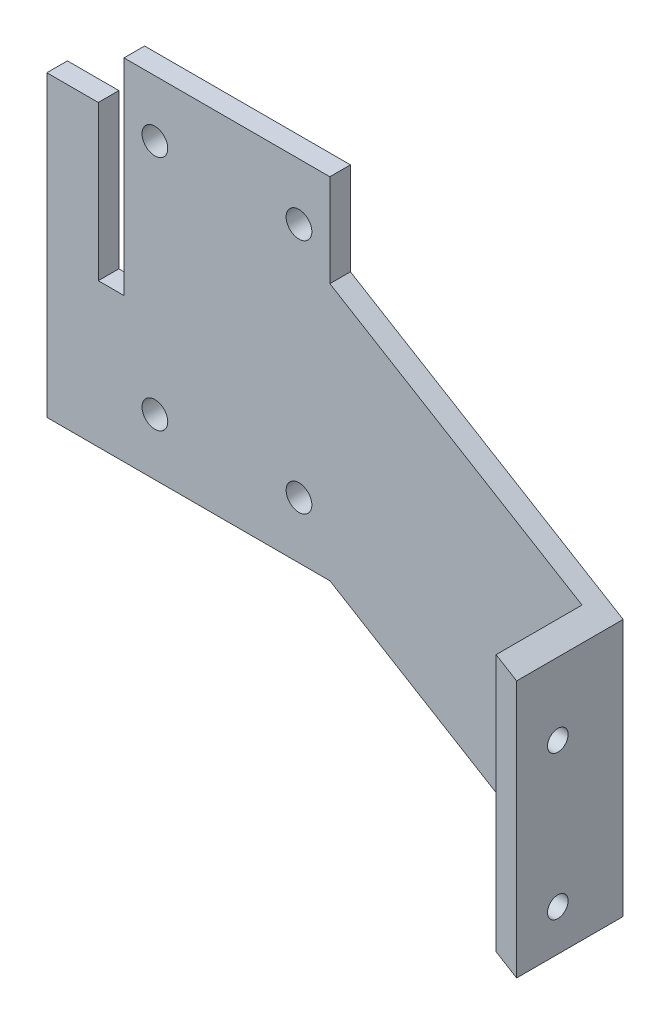
ISO-10303-21;
HEADER;
FILE_DESCRIPTION(('STEP AP214'),'2;1');
FILE_NAME('part.step','',(''),(''),'','','');
FILE_SCHEMA(('AUTOMOTIVE_DESIGN { 1 0 10303 214 1 1 1 1 }'));
ENDSEC;
DATA;
#1=APPLICATION_CONTEXT('core data for automotive mechanical design processes');
#2=APPLICATION_PROTOCOL_DEFINITION('international standard','automotive_design',2000,#1);
#3=PRODUCT_CONTEXT('',#1,'mechanical');
#4=PRODUCT('Part','Part','',(#3));
#5=PRODUCT_RELATED_PRODUCT_CATEGORY('part','',(#4));
#6=PRODUCT_DEFINITION_FORMATION('','',#4);
#7=PRODUCT_DEFINITION_CONTEXT('part definition',#1,'design');
#8=PRODUCT_DEFINITION('design','',#6,#7);
#9=PRODUCT_DEFINITION_SHAPE('','',#8);
#10=(LENGTH_UNIT() NAMED_UNIT(*) SI_UNIT(.MILLI.,.METRE.));
#11=(NAMED_UNIT(*) PLANE_ANGLE_UNIT() SI_UNIT($,.RADIAN.));
#12=(NAMED_UNIT(*) SI_UNIT($,.STERADIAN.) SOLID_ANGLE_UNIT());
#13=UNCERTAINTY_MEASURE_WITH_UNIT(LENGTH_MEASURE(1.E-05),#10,'distance_accuracy_value','');
#14=(GEOMETRIC_REPRESENTATION_CONTEXT(3) GLOBAL_UNCERTAINTY_ASSIGNED_CONTEXT((#13)) GLOBAL_UNIT_ASSIGNED_CONTEXT((#10,
#11,#12)) REPRESENTATION_CONTEXT('',''));
#15=CARTESIAN_POINT('',(0.,0.,0.));
#16=DIRECTION('',(0.,0.,1.));
#17=DIRECTION('',(1.,0.,0.));
#18=AXIS2_PLACEMENT_3D('',#15,#16,#17);
#19=CARTESIAN_POINT('',(0.,0.,4.));
#20=DIRECTION('',(0.,0.,-1.));
#21=DIRECTION('',(-1.,0.,0.));
#22=AXIS2_PLACEMENT_3D('',#19,#20,#21);
#23=PLANE('',#22);
#24=CARTESIAN_POINT('',(93.,0.,4.));
#25=DIRECTION('',(0.,0.,1.));
#26=DIRECTION('',(1.,0.,0.));
#27=AXIS2_PLACEMENT_3D('',#24,#25,#26);
#28=CIRCLE('',#27,2.5);
#29=CARTESIAN_POINT('',(95.5,0.,4.));
#30=VERTEX_POINT('',#29);
#31=EDGE_CURVE('E186',#30,#30,#28,.T.);
#32=ORIENTED_EDGE('',*,*,#31,.F.);
#33=EDGE_LOOP('',(#32));
#34=FACE_BOUND('',#33,.T.);
#35=CARTESIAN_POINT('',(49.,11.,4.));
#36=DIRECTION('',(0.,0.,1.));
#37=DIRECTION('',(1.,0.,0.));
#38=AXIS2_PLACEMENT_3D('',#35,#36,#37);
#39=CIRCLE('',#38,2.5);
#40=CARTESIAN_POINT('',(51.5,11.,4.));
#41=VERTEX_POINT('',#40);
#42=EDGE_CURVE('E194',#41,#41,#39,.T.);
#43=ORIENTED_EDGE('',*,*,#42,.F.);
#44=EDGE_LOOP('',(#43));
#45=FACE_BOUND('',#44,.T.);
#46=CARTESIAN_POINT('',(21.,11.,4.));
#47=DIRECTION('',(0.,0.,1.));
#48=DIRECTION('',(1.,0.,0.));
#49=AXIS2_PLACEMENT_3D('',#46,#47,#48);
#50=CIRCLE('',#49,2.5);
#51=CARTESIAN_POINT('',(23.5,11.,4.));
#52=VERTEX_POINT('',#51);
#53=EDGE_CURVE('E200',#52,#52,#50,.T.);
#54=ORIENTED_EDGE('',*,*,#53,.F.);
#55=EDGE_LOOP('',(#54));
#56=FACE_BOUND('',#55,.T.);
#57=CARTESIAN_POINT('',(49.,57.,4.));
#58=DIRECTION('',(0.,0.,1.));
#59=DIRECTION('',(1.,0.,0.));
#60=AXIS2_PLACEMENT_3D('',#57,#58,#59);
#61=CIRCLE('',#60,2.5);
#62=CARTESIAN_POINT('',(51.5,57.,4.));
#63=VERTEX_POINT('',#62);
#64=EDGE_CURVE('E206',#63,#63,#61,.T.);
#65=ORIENTED_EDGE('',*,*,#64,.F.);
#66=EDGE_LOOP('',(#65));
#67=FACE_BOUND('',#66,.T.);
#68=CARTESIAN_POINT('',(21.,57.,4.));
#69=DIRECTION('',(0.,0.,1.));
#70=DIRECTION('',(1.,0.,0.));
#71=AXIS2_PLACEMENT_3D('',#68,#69,#70);
#72=CIRCLE('',#71,2.5);
#73=CARTESIAN_POINT('',(23.5,57.,4.));
#74=VERTEX_POINT('',#73);
#75=EDGE_CURVE('E210',#74,#74,#72,.T.);
#76=ORIENTED_EDGE('',*,*,#75,.F.);
#77=EDGE_LOOP('',(#76));
#78=FACE_BOUND('',#77,.T.);
#79=DIRECTION('',(-1.,0.,0.));
#80=VECTOR('',#79,1.);
#81=CARTESIAN_POINT('',(0.,68.,4.));
#82=LINE('',#81,#80);
#83=CARTESIAN_POINT('',(55.,68.,4.));
#84=VERTEX_POINT('',#83);
#85=CARTESIAN_POINT('',(15.,68.,4.));
#86=VERTEX_POINT('',#85);
#87=EDGE_CURVE('E295',#84,#86,#82,.T.);
#88=ORIENTED_EDGE('',*,*,#87,.T.);
#89=DIRECTION('',(0.,1.,0.));
#90=VECTOR('',#89,1.);
#91=CARTESIAN_POINT('',(15.,68.,4.));
#92=LINE('',#91,#90);
#93=CARTESIAN_POINT('',(15.,28.,4.));
#94=VERTEX_POINT('',#93);
#95=EDGE_CURVE('E50',#94,#86,#92,.T.);
#96=ORIENTED_EDGE('',*,*,#95,.F.);
#97=DIRECTION('',(1.,0.,0.));
#98=VECTOR('',#97,1.);
#99=CARTESIAN_POINT('',(15.,28.,4.));
#100=LINE('',#99,#98);
#101=CARTESIAN_POINT('',(10.,28.,4.));
#102=VERTEX_POINT('',#101);
#103=EDGE_CURVE('E332',#102,#94,#100,.T.);
#104=ORIENTED_EDGE('',*,*,#103,.F.);
#105=DIRECTION('',(0.,-1.,0.));
#106=VECTOR('',#105,1.);
#107=CARTESIAN_POINT('',(10.,58.,4.));
#108=LINE('',#107,#106);
#109=CARTESIAN_POINT('',(10.,58.,4.));
#110=VERTEX_POINT('',#109);
#111=EDGE_CURVE('E147',#110,#102,#108,.T.);
#112=ORIENTED_EDGE('',*,*,#111,.F.);
#113=DIRECTION('',(1.,0.,0.));
#114=VECTOR('',#113,1.);
#115=CARTESIAN_POINT('',(0.,58.,4.));
#116=LINE('',#115,#114);
#117=CARTESIAN_POINT('',(0.,58.,4.));
#118=VERTEX_POINT('',#117);
#119=EDGE_CURVE('E133',#118,#110,#116,.T.);
#120=ORIENTED_EDGE('',*,*,#119,.F.);
#121=DIRECTION('',(0.,-1.,0.));
#122=VECTOR('',#121,1.);
#123=CARTESIAN_POINT('',(0.,0.,4.));
#124=LINE('',#123,#122);
#125=CARTESIAN_POINT('',(0.,0.,4.));
#126=VERTEX_POINT('',#125);
#127=EDGE_CURVE('E143',#118,#126,#124,.T.);
#128=ORIENTED_EDGE('',*,*,#127,.T.);
#129=DIRECTION('',(1.,0.,0.));
#130=VECTOR('',#129,1.);
#131=CARTESIAN_POINT('',(0.,0.,4.));
#132=LINE('',#131,#130);
#133=CARTESIAN_POINT('',(55.,0.,4.));
#134=VERTEX_POINT('',#133);
#135=EDGE_CURVE('E152',#126,#134,#132,.T.);
#136=ORIENTED_EDGE('',*,*,#135,.T.);
#137=DIRECTION('',(0.856064445274926,-0.516869099033917,0.));
#138=VECTOR('',#137,1.);
#139=CARTESIAN_POINT('',(108.,-32.,4.));
#140=LINE('',#139,#138);
#141=CARTESIAN_POINT('',(104.,-29.5849056603774,4.));
#142=VERTEX_POINT('',#141);
#143=EDGE_CURVE('E155',#134,#142,#140,.T.);
#144=ORIENTED_EDGE('',*,*,#143,.T.);
#145=DIRECTION('',(0.,-1.,0.));
#146=VECTOR('',#145,1.);
#147=CARTESIAN_POINT('',(104.,-29.5849056603774,4.));
#148=LINE('',#147,#146);
#149=CARTESIAN_POINT('',(104.,20.4150943396226,4.));
#150=VERTEX_POINT('',#149);
#151=EDGE_CURVE('E58',#150,#142,#148,.T.);
#152=ORIENTED_EDGE('',*,*,#151,.F.);
#153=DIRECTION('',(-0.856064445274926,0.516869099033917,0.));
#154=VECTOR('',#153,1.);
#155=CARTESIAN_POINT('',(108.,18.,4.));
#156=LINE('',#155,#154);
#157=CARTESIAN_POINT('',(55.,50.,4.));
#158=VERTEX_POINT('',#157);
#159=EDGE_CURVE('E171',#150,#158,#156,.T.);
#160=ORIENTED_EDGE('',*,*,#159,.T.);
#161=DIRECTION('',(0.,1.,0.));
#162=VECTOR('',#161,1.);
#163=CARTESIAN_POINT('',(55.,68.,4.));
#164=LINE('',#163,#162);
#165=EDGE_CURVE('E174',#158,#84,#164,.T.);
#166=ORIENTED_EDGE('',*,*,#165,.T.);
#167=EDGE_LOOP('',(#88,#96,#104,#112,#120,#128,#136,#144,#152,#160,#166));
#168=FACE_BOUND('',#167,.T.);
#169=ADVANCED_FACE('F35',(#34,#45,#56,#67,#78,#168),#23,.F.);
#170=CARTESIAN_POINT('',(0.,0.,0.));
#171=DIRECTION('',(0.,0.,-1.));
#172=DIRECTION('',(-1.,0.,0.));
#173=AXIS2_PLACEMENT_3D('',#170,#171,#172);
#174=PLANE('',#173);
#175=DIRECTION('',(0.,-1.,0.));
#176=VECTOR('',#175,1.);
#177=CARTESIAN_POINT('',(15.,0.,0.));
#178=LINE('',#177,#176);
#179=CARTESIAN_POINT('',(15.,68.,0.));
#180=VERTEX_POINT('',#179);
#181=CARTESIAN_POINT('',(15.,28.,0.));
#182=VERTEX_POINT('',#181);
#183=EDGE_CURVE('E324',#180,#182,#178,.T.);
#184=ORIENTED_EDGE('',*,*,#183,.F.);
#185=DIRECTION('',(-1.,0.,0.));
#186=VECTOR('',#185,1.);
#187=CARTESIAN_POINT('',(0.,68.,0.));
#188=LINE('',#187,#186);
#189=CARTESIAN_POINT('',(55.,68.,0.));
#190=VERTEX_POINT('',#189);
#191=EDGE_CURVE('E153',#190,#180,#188,.T.);
#192=ORIENTED_EDGE('',*,*,#191,.F.);
#193=DIRECTION('',(0.,1.,0.));
#194=VECTOR('',#193,1.);
#195=CARTESIAN_POINT('',(55.,68.,0.));
#196=LINE('',#195,#194);
#197=CARTESIAN_POINT('',(55.,50.,0.));
#198=VERTEX_POINT('',#197);
#199=EDGE_CURVE('E158',#198,#190,#196,.T.);
#200=ORIENTED_EDGE('',*,*,#199,.F.);
#201=DIRECTION('',(-0.856064445274926,0.516869099033917,0.));
#202=VECTOR('',#201,1.);
#203=CARTESIAN_POINT('',(108.,18.,0.));
#204=LINE('',#203,#202);
#205=CARTESIAN_POINT('',(108.,18.,0.));
#206=VERTEX_POINT('',#205);
#207=EDGE_CURVE('E286',#206,#198,#204,.T.);
#208=ORIENTED_EDGE('',*,*,#207,.F.);
#209=DIRECTION('',(0.,1.,0.));
#210=VECTOR('',#209,1.);
#211=CARTESIAN_POINT('',(108.,0.,0.));
#212=LINE('',#211,#210);
#213=CARTESIAN_POINT('',(108.,-32.,0.));
#214=VERTEX_POINT('',#213);
#215=EDGE_CURVE('E284',#214,#206,#212,.T.);
#216=ORIENTED_EDGE('',*,*,#215,.F.);
#217=DIRECTION('',(0.856064445274926,-0.516869099033917,0.));
#218=VECTOR('',#217,1.);
#219=CARTESIAN_POINT('',(108.,-32.,0.));
#220=LINE('',#219,#218);
#221=CARTESIAN_POINT('',(55.,0.,0.));
#222=VERTEX_POINT('',#221);
#223=EDGE_CURVE('E275',#222,#214,#220,.T.);
#224=ORIENTED_EDGE('',*,*,#223,.F.);
#225=DIRECTION('',(1.,0.,0.));
#226=VECTOR('',#225,1.);
#227=CARTESIAN_POINT('',(0.,0.,0.));
#228=LINE('',#227,#226);
#229=CARTESIAN_POINT('',(0.,0.,0.));
#230=VERTEX_POINT('',#229);
#231=EDGE_CURVE('E215',#230,#222,#228,.T.);
#232=ORIENTED_EDGE('',*,*,#231,.F.);
#233=DIRECTION('',(0.,-1.,0.));
#234=VECTOR('',#233,1.);
#235=CARTESIAN_POINT('',(0.,0.,0.));
#236=LINE('',#235,#234);
#237=CARTESIAN_POINT('',(0.,58.,0.));
#238=VERTEX_POINT('',#237);
#239=EDGE_CURVE('E212',#238,#230,#236,.T.);
#240=ORIENTED_EDGE('',*,*,#239,.F.);
#241=DIRECTION('',(-1.,0.,0.));
#242=VECTOR('',#241,1.);
#243=CARTESIAN_POINT('',(0.,58.,0.));
#244=LINE('',#243,#242);
#245=CARTESIAN_POINT('',(10.,58.,0.));
#246=VERTEX_POINT('',#245);
#247=EDGE_CURVE('E136',#246,#238,#244,.T.);
#248=ORIENTED_EDGE('',*,*,#247,.F.);
#249=DIRECTION('',(0.,1.,0.));
#250=VECTOR('',#249,1.);
#251=CARTESIAN_POINT('',(10.,0.,0.));
#252=LINE('',#251,#250);
#253=CARTESIAN_POINT('',(10.,28.,0.));
#254=VERTEX_POINT('',#253);
#255=EDGE_CURVE('E43',#254,#246,#252,.T.);
#256=ORIENTED_EDGE('',*,*,#255,.F.);
#257=DIRECTION('',(-1.,0.,0.));
#258=VECTOR('',#257,1.);
#259=CARTESIAN_POINT('',(0.,28.,0.));
#260=LINE('',#259,#258);
#261=EDGE_CURVE('E11',#182,#254,#260,.T.);
#262=ORIENTED_EDGE('',*,*,#261,.F.);
#263=EDGE_LOOP('',(#184,#192,#200,#208,#216,#224,#232,#240,#248,#256,#262));
#264=FACE_BOUND('',#263,.T.);
#265=CARTESIAN_POINT('',(49.,11.,0.));
#266=DIRECTION('',(0.,0.,1.));
#267=DIRECTION('',(1.,0.,0.));
#268=AXIS2_PLACEMENT_3D('',#265,#266,#267);
#269=CIRCLE('',#268,2.5);
#270=CARTESIAN_POINT('',(51.5,11.,0.));
#271=VERTEX_POINT('',#270);
#272=EDGE_CURVE('E189',#271,#271,#269,.T.);
#273=ORIENTED_EDGE('',*,*,#272,.T.);
#274=EDGE_LOOP('',(#273));
#275=FACE_BOUND('',#274,.T.);
#276=CARTESIAN_POINT('',(49.,57.,0.));
#277=DIRECTION('',(0.,0.,1.));
#278=DIRECTION('',(1.,0.,0.));
#279=AXIS2_PLACEMENT_3D('',#276,#277,#278);
#280=CIRCLE('',#279,2.5);
#281=CARTESIAN_POINT('',(51.5,57.,0.));
#282=VERTEX_POINT('',#281);
#283=EDGE_CURVE('E203',#282,#282,#280,.T.);
#284=ORIENTED_EDGE('',*,*,#283,.T.);
#285=EDGE_LOOP('',(#284));
#286=FACE_BOUND('',#285,.T.);
#287=CARTESIAN_POINT('',(21.,57.,0.));
#288=DIRECTION('',(0.,0.,1.));
#289=DIRECTION('',(1.,0.,0.));
#290=AXIS2_PLACEMENT_3D('',#287,#288,#289);
#291=CIRCLE('',#290,2.5);
#292=CARTESIAN_POINT('',(23.5,57.,0.));
#293=VERTEX_POINT('',#292);
#294=EDGE_CURVE('E161',#293,#293,#291,.T.);
#295=ORIENTED_EDGE('',*,*,#294,.T.);
#296=EDGE_LOOP('',(#295));
#297=FACE_BOUND('',#296,.T.);
#298=CARTESIAN_POINT('',(21.,11.,0.));
#299=DIRECTION('',(0.,0.,1.));
#300=DIRECTION('',(1.,0.,0.));
#301=AXIS2_PLACEMENT_3D('',#298,#299,#300);
#302=CIRCLE('',#301,2.5);
#303=CARTESIAN_POINT('',(23.5,11.,0.));
#304=VERTEX_POINT('',#303);
#305=EDGE_CURVE('E197',#304,#304,#302,.T.);
#306=ORIENTED_EDGE('',*,*,#305,.T.);
#307=EDGE_LOOP('',(#306));
#308=FACE_BOUND('',#307,.T.);
#309=CARTESIAN_POINT('',(93.,0.,0.));
#310=DIRECTION('',(0.,0.,1.));
#311=DIRECTION('',(1.,0.,0.));
#312=AXIS2_PLACEMENT_3D('',#309,#310,#311);
#313=CIRCLE('',#312,2.5);
#314=CARTESIAN_POINT('',(95.5,0.,0.));
#315=VERTEX_POINT('',#314);
#316=EDGE_CURVE('E190',#315,#315,#313,.T.);
#317=ORIENTED_EDGE('',*,*,#316,.T.);
#318=EDGE_LOOP('',(#317));
#319=FACE_BOUND('',#318,.T.);
#320=ADVANCED_FACE('F220',(#264,#275,#286,#297,#308,#319),#174,.T.);
#321=CARTESIAN_POINT('',(0.,0.,4.));
#322=DIRECTION('',(1.,0.,0.));
#323=DIRECTION('',(0.,0.,-1.));
#324=AXIS2_PLACEMENT_3D('',#321,#322,#323);
#325=PLANE('',#324);
#326=ORIENTED_EDGE('',*,*,#127,.F.);
#327=DIRECTION('',(0.,0.,1.));
#328=VECTOR('',#327,1.);
#329=CARTESIAN_POINT('',(0.,58.,-6.));
#330=LINE('',#329,#328);
#331=EDGE_CURVE('E129',#238,#118,#330,.T.);
#332=ORIENTED_EDGE('',*,*,#331,.F.);
#333=ORIENTED_EDGE('',*,*,#239,.T.);
#334=DIRECTION('',(0.,0.,-1.));
#335=VECTOR('',#334,1.);
#336=CARTESIAN_POINT('',(0.,0.,4.));
#337=LINE('',#336,#335);
#338=EDGE_CURVE('E151',#126,#230,#337,.T.);
#339=ORIENTED_EDGE('',*,*,#338,.F.);
#340=EDGE_LOOP('',(#326,#332,#333,#339));
#341=FACE_BOUND('',#340,.T.);
#342=ADVANCED_FACE('F37',(#341),#325,.F.);
#343=CARTESIAN_POINT('',(0.,0.,4.));
#344=DIRECTION('',(0.,1.,0.));
#345=DIRECTION('',(0.,0.,1.));
#346=AXIS2_PLACEMENT_3D('',#343,#344,#345);
#347=PLANE('',#346);
#348=ORIENTED_EDGE('',*,*,#231,.T.);
#349=DIRECTION('',(0.,0.,-1.));
#350=VECTOR('',#349,1.);
#351=CARTESIAN_POINT('',(55.,0.,4.));
#352=LINE('',#351,#350);
#353=EDGE_CURVE('E272',#134,#222,#352,.T.);
#354=ORIENTED_EDGE('',*,*,#353,.F.);
#355=ORIENTED_EDGE('',*,*,#135,.F.);
#356=ORIENTED_EDGE('',*,*,#338,.T.);
#357=EDGE_LOOP('',(#348,#354,#355,#356));
#358=FACE_BOUND('',#357,.T.);
#359=ADVANCED_FACE('F262',(#358),#347,.F.);
#360=CARTESIAN_POINT('',(108.,-32.,4.));
#361=DIRECTION('',(0.516869099033917,0.856064445274926,0.));
#362=DIRECTION('',(-0.856064445274926,0.516869099033918,0.));
#363=AXIS2_PLACEMENT_3D('',#360,#361,#362);
#364=PLANE('',#363);
#365=ORIENTED_EDGE('',*,*,#223,.T.);
#366=DIRECTION('',(0.,0.,-1.));
#367=VECTOR('',#366,1.);
#368=CARTESIAN_POINT('',(108.,-32.,4.));
#369=LINE('',#368,#367);
#370=CARTESIAN_POINT('',(108.,-32.,20.7));
#371=VERTEX_POINT('',#370);
#372=EDGE_CURVE('E280',#371,#214,#369,.T.);
#373=ORIENTED_EDGE('',*,*,#372,.F.);
#374=DIRECTION('',(0.856064445274926,-0.516869099033917,0.));
#375=VECTOR('',#374,1.);
#376=CARTESIAN_POINT('',(108.,-32.,20.7));
#377=LINE('',#376,#375);
#378=CARTESIAN_POINT('',(104.,-29.5849056603774,20.7));
#379=VERTEX_POINT('',#378);
#380=EDGE_CURVE('E306',#379,#371,#377,.T.);
#381=ORIENTED_EDGE('',*,*,#380,.F.);
#382=DIRECTION('',(0.,0.,-1.));
#383=VECTOR('',#382,1.);
#384=CARTESIAN_POINT('',(104.,-29.5849056603774,20.7));
#385=LINE('',#384,#383);
#386=EDGE_CURVE('E179',#379,#142,#385,.T.);
#387=ORIENTED_EDGE('',*,*,#386,.T.);
#388=ORIENTED_EDGE('',*,*,#143,.F.);
#389=ORIENTED_EDGE('',*,*,#353,.T.);
#390=EDGE_LOOP('',(#365,#373,#381,#387,#388,#389));
#391=FACE_BOUND('',#390,.T.);
#392=ADVANCED_FACE('F259',(#391),#364,.F.);
#393=CARTESIAN_POINT('',(108.,0.,4.));
#394=DIRECTION('',(-1.,0.,0.));
#395=DIRECTION('',(0.,0.,1.));
#396=AXIS2_PLACEMENT_3D('',#393,#394,#395);
#397=PLANE('',#396);
#398=CARTESIAN_POINT('',(108.,-24.,12.7));
#399=DIRECTION('',(1.,0.,0.));
#400=DIRECTION('',(0.,0.,-1.));
#401=AXIS2_PLACEMENT_3D('',#398,#399,#400);
#402=CIRCLE('',#401,2.);
#403=CARTESIAN_POINT('',(108.,-24.,10.7));
#404=VERTEX_POINT('',#403);
#405=EDGE_CURVE('E320',#404,#404,#402,.T.);
#406=ORIENTED_EDGE('',*,*,#405,.F.);
#407=EDGE_LOOP('',(#406));
#408=FACE_BOUND('',#407,.T.);
#409=CARTESIAN_POINT('',(108.,4.,12.7));
#410=DIRECTION('',(1.,0.,0.));
#411=DIRECTION('',(0.,0.,-1.));
#412=AXIS2_PLACEMENT_3D('',#409,#410,#411);
#413=CIRCLE('',#412,2.);
#414=CARTESIAN_POINT('',(108.,4.,10.7));
#415=VERTEX_POINT('',#414);
#416=EDGE_CURVE('E316',#415,#415,#413,.T.);
#417=ORIENTED_EDGE('',*,*,#416,.F.);
#418=EDGE_LOOP('',(#417));
#419=FACE_BOUND('',#418,.T.);
#420=ORIENTED_EDGE('',*,*,#215,.T.);
#421=DIRECTION('',(0.,0.,-1.));
#422=VECTOR('',#421,1.);
#423=CARTESIAN_POINT('',(108.,18.,4.));
#424=LINE('',#423,#422);
#425=CARTESIAN_POINT('',(108.,18.,20.7));
#426=VERTEX_POINT('',#425);
#427=EDGE_CURVE('E298',#426,#206,#424,.T.);
#428=ORIENTED_EDGE('',*,*,#427,.F.);
#429=DIRECTION('',(0.,1.,0.));
#430=VECTOR('',#429,1.);
#431=CARTESIAN_POINT('',(108.,18.,20.7));
#432=LINE('',#431,#430);
#433=EDGE_CURVE('E184',#371,#426,#432,.T.);
#434=ORIENTED_EDGE('',*,*,#433,.F.);
#435=ORIENTED_EDGE('',*,*,#372,.T.);
#436=EDGE_LOOP('',(#420,#428,#434,#435));
#437=FACE_BOUND('',#436,.T.);
#438=ADVANCED_FACE('F255',(#408,#419,#437),#397,.F.);
#439=CARTESIAN_POINT('',(108.,18.,4.));
#440=DIRECTION('',(-0.516869099033917,-0.856064445274926,0.));
#441=DIRECTION('',(0.856064445274926,-0.516869099033918,0.));
#442=AXIS2_PLACEMENT_3D('',#439,#440,#441);
#443=PLANE('',#442);
#444=ORIENTED_EDGE('',*,*,#207,.T.);
#445=DIRECTION('',(0.,0.,-1.));
#446=VECTOR('',#445,1.);
#447=CARTESIAN_POINT('',(55.,50.,4.));
#448=LINE('',#447,#446);
#449=EDGE_CURVE('E294',#158,#198,#448,.T.);
#450=ORIENTED_EDGE('',*,*,#449,.F.);
#451=ORIENTED_EDGE('',*,*,#159,.F.);
#452=DIRECTION('',(0.,0.,-1.));
#453=VECTOR('',#452,1.);
#454=CARTESIAN_POINT('',(104.,20.4150943396227,20.7));
#455=LINE('',#454,#453);
#456=CARTESIAN_POINT('',(104.,20.4150943396227,20.7));
#457=VERTEX_POINT('',#456);
#458=EDGE_CURVE('E193',#457,#150,#455,.T.);
#459=ORIENTED_EDGE('',*,*,#458,.F.);
#460=DIRECTION('',(-0.856064445274925,0.516869099033918,0.));
#461=VECTOR('',#460,1.);
#462=CARTESIAN_POINT('',(104.,20.4150943396227,20.7));
#463=LINE('',#462,#461);
#464=EDGE_CURVE('E177',#426,#457,#463,.T.);
#465=ORIENTED_EDGE('',*,*,#464,.F.);
#466=ORIENTED_EDGE('',*,*,#427,.T.);
#467=EDGE_LOOP('',(#444,#450,#451,#459,#465,#466));
#468=FACE_BOUND('',#467,.T.);
#469=ADVANCED_FACE('F251',(#468),#443,.F.);
#470=CARTESIAN_POINT('',(55.,68.,4.));
#471=DIRECTION('',(-1.,0.,0.));
#472=DIRECTION('',(0.,-1.,0.));
#473=AXIS2_PLACEMENT_3D('',#470,#471,#472);
#474=PLANE('',#473);
#475=ORIENTED_EDGE('',*,*,#199,.T.);
#476=DIRECTION('',(0.,0.,-1.));
#477=VECTOR('',#476,1.);
#478=CARTESIAN_POINT('',(55.,68.,4.));
#479=LINE('',#478,#477);
#480=EDGE_CURVE('E291',#84,#190,#479,.T.);
#481=ORIENTED_EDGE('',*,*,#480,.F.);
#482=ORIENTED_EDGE('',*,*,#165,.F.);
#483=ORIENTED_EDGE('',*,*,#449,.T.);
#484=EDGE_LOOP('',(#475,#481,#482,#483));
#485=FACE_BOUND('',#484,.T.);
#486=ADVANCED_FACE('F235',(#485),#474,.F.);
#487=CARTESIAN_POINT('',(0.,68.,4.));
#488=DIRECTION('',(0.,-1.,0.));
#489=DIRECTION('',(0.,0.,-1.));
#490=AXIS2_PLACEMENT_3D('',#487,#488,#489);
#491=PLANE('',#490);
#492=ORIENTED_EDGE('',*,*,#191,.T.);
#493=DIRECTION('',(0.,0.,1.));
#494=VECTOR('',#493,1.);
#495=CARTESIAN_POINT('',(15.,68.,4.));
#496=LINE('',#495,#494);
#497=EDGE_CURVE('E344',#180,#86,#496,.T.);
#498=ORIENTED_EDGE('',*,*,#497,.T.);
#499=ORIENTED_EDGE('',*,*,#87,.F.);
#500=ORIENTED_EDGE('',*,*,#480,.T.);
#501=EDGE_LOOP('',(#492,#498,#499,#500));
#502=FACE_BOUND('',#501,.T.);
#503=ADVANCED_FACE('F226',(#502),#491,.F.);
#504=CARTESIAN_POINT('',(21.,57.,4.));
#505=DIRECTION('',(0.,0.,-1.));
#506=DIRECTION('',(-1.,0.,0.));
#507=AXIS2_PLACEMENT_3D('',#504,#505,#506);
#508=CYLINDRICAL_SURFACE('',#507,2.5);
#509=ORIENTED_EDGE('',*,*,#75,.T.);
#510=EDGE_LOOP('',(#509));
#511=FACE_BOUND('',#510,.T.);
#512=ORIENTED_EDGE('',*,*,#294,.F.);
#513=EDGE_LOOP('',(#512));
#514=FACE_BOUND('',#513,.T.);
#515=ADVANCED_FACE('F223',(#511,#514),#508,.F.);
#516=CARTESIAN_POINT('',(49.,57.,4.));
#517=DIRECTION('',(0.,0.,-1.));
#518=DIRECTION('',(-1.,0.,0.));
#519=AXIS2_PLACEMENT_3D('',#516,#517,#518);
#520=CYLINDRICAL_SURFACE('',#519,2.5);
#521=ORIENTED_EDGE('',*,*,#64,.T.);
#522=EDGE_LOOP('',(#521));
#523=FACE_BOUND('',#522,.T.);
#524=ORIENTED_EDGE('',*,*,#283,.F.);
#525=EDGE_LOOP('',(#524));
#526=FACE_BOUND('',#525,.T.);
#527=ADVANCED_FACE('F225',(#523,#526),#520,.F.);
#528=CARTESIAN_POINT('',(21.,11.,4.));
#529=DIRECTION('',(0.,0.,-1.));
#530=DIRECTION('',(-1.,0.,0.));
#531=AXIS2_PLACEMENT_3D('',#528,#529,#530);
#532=CYLINDRICAL_SURFACE('',#531,2.5);
#533=ORIENTED_EDGE('',*,*,#53,.T.);
#534=EDGE_LOOP('',(#533));
#535=FACE_BOUND('',#534,.T.);
#536=ORIENTED_EDGE('',*,*,#305,.F.);
#537=EDGE_LOOP('',(#536));
#538=FACE_BOUND('',#537,.T.);
#539=ADVANCED_FACE('F232',(#535,#538),#532,.F.);
#540=CARTESIAN_POINT('',(49.,11.,4.));
#541=DIRECTION('',(0.,0.,-1.));
#542=DIRECTION('',(-1.,0.,0.));
#543=AXIS2_PLACEMENT_3D('',#540,#541,#542);
#544=CYLINDRICAL_SURFACE('',#543,2.5);
#545=ORIENTED_EDGE('',*,*,#42,.T.);
#546=EDGE_LOOP('',(#545));
#547=FACE_BOUND('',#546,.T.);
#548=ORIENTED_EDGE('',*,*,#272,.F.);
#549=EDGE_LOOP('',(#548));
#550=FACE_BOUND('',#549,.T.);
#551=ADVANCED_FACE('F392',(#547,#550),#544,.F.);
#552=CARTESIAN_POINT('',(93.,0.,4.));
#553=DIRECTION('',(0.,0.,-1.));
#554=DIRECTION('',(-1.,0.,0.));
#555=AXIS2_PLACEMENT_3D('',#552,#553,#554);
#556=CYLINDRICAL_SURFACE('',#555,2.5);
#557=ORIENTED_EDGE('',*,*,#31,.T.);
#558=EDGE_LOOP('',(#557));
#559=FACE_BOUND('',#558,.T.);
#560=ORIENTED_EDGE('',*,*,#316,.F.);
#561=EDGE_LOOP('',(#560));
#562=FACE_BOUND('',#561,.T.);
#563=ADVANCED_FACE('F388',(#559,#562),#556,.F.);
#564=CARTESIAN_POINT('',(104.,-29.5849056603774,20.7));
#565=DIRECTION('',(1.,0.,0.));
#566=DIRECTION('',(0.,0.,-1.));
#567=AXIS2_PLACEMENT_3D('',#564,#565,#566);
#568=PLANE('',#567);
#569=CARTESIAN_POINT('',(104.,-24.,12.7));
#570=DIRECTION('',(1.,0.,0.));
#571=DIRECTION('',(0.,0.,-1.));
#572=AXIS2_PLACEMENT_3D('',#569,#570,#571);
#573=CIRCLE('',#572,2.);
#574=CARTESIAN_POINT('',(104.,-24.,10.7));
#575=VERTEX_POINT('',#574);
#576=EDGE_CURVE('E319',#575,#575,#573,.T.);
#577=ORIENTED_EDGE('',*,*,#576,.T.);
#578=EDGE_LOOP('',(#577));
#579=FACE_BOUND('',#578,.T.);
#580=CARTESIAN_POINT('',(104.,4.,12.7));
#581=DIRECTION('',(1.,0.,0.));
#582=DIRECTION('',(0.,0.,-1.));
#583=AXIS2_PLACEMENT_3D('',#580,#581,#582);
#584=CIRCLE('',#583,2.);
#585=CARTESIAN_POINT('',(104.,4.,10.7));
#586=VERTEX_POINT('',#585);
#587=EDGE_CURVE('E178',#586,#586,#584,.T.);
#588=ORIENTED_EDGE('',*,*,#587,.T.);
#589=EDGE_LOOP('',(#588));
#590=FACE_BOUND('',#589,.T.);
#591=ORIENTED_EDGE('',*,*,#151,.T.);
#592=ORIENTED_EDGE('',*,*,#386,.F.);
#593=DIRECTION('',(0.,-1.,0.));
#594=VECTOR('',#593,1.);
#595=CARTESIAN_POINT('',(104.,-29.5849056603774,20.7));
#596=LINE('',#595,#594);
#597=EDGE_CURVE('E311',#457,#379,#596,.T.);
#598=ORIENTED_EDGE('',*,*,#597,.F.);
#599=ORIENTED_EDGE('',*,*,#458,.T.);
#600=EDGE_LOOP('',(#591,#592,#598,#599));
#601=FACE_BOUND('',#600,.T.);
#602=ADVANCED_FACE('F357',(#579,#590,#601),#568,.F.);
#603=CARTESIAN_POINT('',(0.,0.,20.7));
#604=DIRECTION('',(0.,0.,-1.));
#605=DIRECTION('',(-1.,0.,0.));
#606=AXIS2_PLACEMENT_3D('',#603,#604,#605);
#607=PLANE('',#606);
#608=ORIENTED_EDGE('',*,*,#464,.T.);
#609=ORIENTED_EDGE('',*,*,#597,.T.);
#610=ORIENTED_EDGE('',*,*,#380,.T.);
#611=ORIENTED_EDGE('',*,*,#433,.T.);
#612=EDGE_LOOP('',(#608,#609,#610,#611));
#613=FACE_BOUND('',#612,.T.);
#614=ADVANCED_FACE('F309',(#613),#607,.F.);
#615=CARTESIAN_POINT('',(98.,4.,12.7));
#616=DIRECTION('',(1.,0.,0.));
#617=DIRECTION('',(0.,0.,-1.));
#618=AXIS2_PLACEMENT_3D('',#615,#616,#617);
#619=CYLINDRICAL_SURFACE('',#618,2.);
#620=ORIENTED_EDGE('',*,*,#416,.T.);
#621=EDGE_LOOP('',(#620));
#622=FACE_BOUND('',#621,.T.);
#623=ORIENTED_EDGE('',*,*,#587,.F.);
#624=EDGE_LOOP('',(#623));
#625=FACE_BOUND('',#624,.T.);
#626=ADVANCED_FACE('F373',(#622,#625),#619,.F.);
#627=CARTESIAN_POINT('',(98.,-24.,12.7));
#628=DIRECTION('',(1.,0.,0.));
#629=DIRECTION('',(0.,0.,-1.));
#630=AXIS2_PLACEMENT_3D('',#627,#628,#629);
#631=CYLINDRICAL_SURFACE('',#630,2.);
#632=ORIENTED_EDGE('',*,*,#405,.T.);
#633=EDGE_LOOP('',(#632));
#634=FACE_BOUND('',#633,.T.);
#635=ORIENTED_EDGE('',*,*,#576,.F.);
#636=EDGE_LOOP('',(#635));
#637=FACE_BOUND('',#636,.T.);
#638=ADVANCED_FACE('F366',(#634,#637),#631,.F.);
#639=CARTESIAN_POINT('',(15.,68.,-6.));
#640=DIRECTION('',(1.,0.,0.));
#641=DIRECTION('',(0.,1.,0.));
#642=AXIS2_PLACEMENT_3D('',#639,#640,#641);
#643=PLANE('',#642);
#644=ORIENTED_EDGE('',*,*,#183,.T.);
#645=DIRECTION('',(0.,0.,1.));
#646=VECTOR('',#645,1.);
#647=CARTESIAN_POINT('',(15.,28.,-6.));
#648=LINE('',#647,#646);
#649=EDGE_CURVE('E325',#182,#94,#648,.T.);
#650=ORIENTED_EDGE('',*,*,#649,.T.);
#651=ORIENTED_EDGE('',*,*,#95,.T.);
#652=ORIENTED_EDGE('',*,*,#497,.F.);
#653=EDGE_LOOP('',(#644,#650,#651,#652));
#654=FACE_BOUND('',#653,.T.);
#655=ADVANCED_FACE('F364',(#654),#643,.F.);
#656=CARTESIAN_POINT('',(15.,28.,-6.));
#657=DIRECTION('',(0.,-1.,0.));
#658=DIRECTION('',(0.,0.,-1.));
#659=AXIS2_PLACEMENT_3D('',#656,#657,#658);
#660=PLANE('',#659);
#661=ORIENTED_EDGE('',*,*,#261,.T.);
#662=DIRECTION('',(0.,0.,1.));
#663=VECTOR('',#662,1.);
#664=CARTESIAN_POINT('',(10.,28.,-6.));
#665=LINE('',#664,#663);
#666=EDGE_CURVE('E328',#254,#102,#665,.T.);
#667=ORIENTED_EDGE('',*,*,#666,.T.);
#668=ORIENTED_EDGE('',*,*,#103,.T.);
#669=ORIENTED_EDGE('',*,*,#649,.F.);
#670=EDGE_LOOP('',(#661,#667,#668,#669));
#671=FACE_BOUND('',#670,.T.);
#672=ADVANCED_FACE('F341',(#671),#660,.F.);
#673=CARTESIAN_POINT('',(10.,58.,-6.));
#674=DIRECTION('',(-1.,0.,0.));
#675=DIRECTION('',(0.,-1.,0.));
#676=AXIS2_PLACEMENT_3D('',#673,#674,#675);
#677=PLANE('',#676);
#678=ORIENTED_EDGE('',*,*,#255,.T.);
#679=DIRECTION('',(0.,0.,1.));
#680=VECTOR('',#679,1.);
#681=CARTESIAN_POINT('',(10.,58.,-6.));
#682=LINE('',#681,#680);
#683=EDGE_CURVE('E140',#246,#110,#682,.T.);
#684=ORIENTED_EDGE('',*,*,#683,.T.);
#685=ORIENTED_EDGE('',*,*,#111,.T.);
#686=ORIENTED_EDGE('',*,*,#666,.F.);
#687=EDGE_LOOP('',(#678,#684,#685,#686));
#688=FACE_BOUND('',#687,.T.);
#689=ADVANCED_FACE('F337',(#688),#677,.F.);
#690=CARTESIAN_POINT('',(0.,58.,-6.));
#691=DIRECTION('',(0.,-1.,0.));
#692=DIRECTION('',(0.,0.,-1.));
#693=AXIS2_PLACEMENT_3D('',#690,#691,#692);
#694=PLANE('',#693);
#695=ORIENTED_EDGE('',*,*,#247,.T.);
#696=ORIENTED_EDGE('',*,*,#331,.T.);
#697=ORIENTED_EDGE('',*,*,#119,.T.);
#698=ORIENTED_EDGE('',*,*,#683,.F.);
#699=EDGE_LOOP('',(#695,#696,#697,#698));
#700=FACE_BOUND('',#699,.T.);
#701=ADVANCED_FACE('F131',(#700),#694,.F.);
#702=CLOSED_SHELL('',(#169,#320,#342,#359,#392,#438,#469,#486,#503,#515,#527,#539,#551,#563,
#602,#614,#626,#638,#655,#672,#689,#701));
#703=MANIFOLD_SOLID_BREP('B2',#702);
#704=ADVANCED_BREP_SHAPE_REPRESENTATION('',(#18,#703),#14);
#705=SHAPE_DEFINITION_REPRESENTATION(#9,#704);
ENDSEC;
END-ISO-10303-21;
